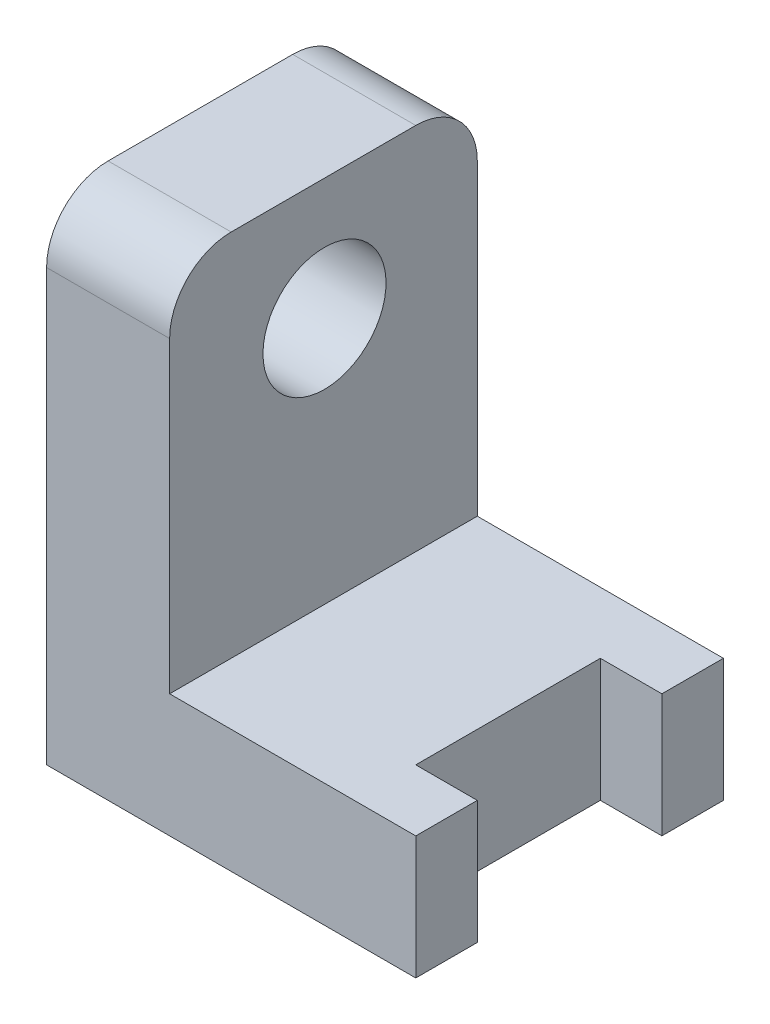
ISO-10303-21;
HEADER;
FILE_DESCRIPTION(('STEP AP214'),'2;1');
FILE_NAME('part.step','',(''),(''),'','','');
FILE_SCHEMA(('AUTOMOTIVE_DESIGN { 1 0 10303 214 1 1 1 1 }'));
ENDSEC;
DATA;
#1=APPLICATION_CONTEXT('core data for automotive mechanical design processes');
#2=APPLICATION_PROTOCOL_DEFINITION('international standard','automotive_design',2000,#1);
#3=PRODUCT_CONTEXT('',#1,'mechanical');
#4=PRODUCT('Part','Part','',(#3));
#5=PRODUCT_RELATED_PRODUCT_CATEGORY('part','',(#4));
#6=PRODUCT_DEFINITION_FORMATION('','',#4);
#7=PRODUCT_DEFINITION_CONTEXT('part definition',#1,'design');
#8=PRODUCT_DEFINITION('design','',#6,#7);
#9=PRODUCT_DEFINITION_SHAPE('','',#8);
#10=(LENGTH_UNIT() NAMED_UNIT(*) SI_UNIT(.MILLI.,.METRE.));
#11=(NAMED_UNIT(*) PLANE_ANGLE_UNIT() SI_UNIT($,.RADIAN.));
#12=(NAMED_UNIT(*) SI_UNIT($,.STERADIAN.) SOLID_ANGLE_UNIT());
#13=UNCERTAINTY_MEASURE_WITH_UNIT(LENGTH_MEASURE(1.E-05),#10,'distance_accuracy_value','');
#14=(GEOMETRIC_REPRESENTATION_CONTEXT(3) GLOBAL_UNCERTAINTY_ASSIGNED_CONTEXT((#13)) GLOBAL_UNIT_ASSIGNED_CONTEXT((#10,
#11,#12)) REPRESENTATION_CONTEXT('',''));
#15=CARTESIAN_POINT('',(0.,0.,0.));
#16=DIRECTION('',(0.,0.,1.));
#17=DIRECTION('',(1.,0.,0.));
#18=AXIS2_PLACEMENT_3D('',#15,#16,#17);
#19=CARTESIAN_POINT('',(30.,0.,12.5));
#20=DIRECTION('',(-1.,0.,0.));
#21=DIRECTION('',(0.,-1.,0.));
#22=AXIS2_PLACEMENT_3D('',#19,#20,#21);
#23=PLANE('',#22);
#24=DIRECTION('',(0.,0.,-1.));
#25=VECTOR('',#24,1.);
#26=CARTESIAN_POINT('',(30.,0.,12.5));
#27=LINE('',#26,#25);
#28=CARTESIAN_POINT('',(30.,0.,12.5));
#29=VERTEX_POINT('',#28);
#30=CARTESIAN_POINT('',(30.,0.,7.5));
#31=VERTEX_POINT('',#30);
#32=EDGE_CURVE('E167',#29,#31,#27,.T.);
#33=ORIENTED_EDGE('',*,*,#32,.T.);
#34=DIRECTION('',(0.,1.,0.));
#35=VECTOR('',#34,1.);
#36=CARTESIAN_POINT('',(30.,-0.000999999999997531,7.5));
#37=LINE('',#36,#35);
#38=CARTESIAN_POINT('',(30.,10.,7.5));
#39=VERTEX_POINT('',#38);
#40=EDGE_CURVE('E149',#31,#39,#37,.T.);
#41=ORIENTED_EDGE('',*,*,#40,.T.);
#42=DIRECTION('',(0.,0.,-1.));
#43=VECTOR('',#42,1.);
#44=CARTESIAN_POINT('',(30.,10.,12.5));
#45=LINE('',#44,#43);
#46=CARTESIAN_POINT('',(30.,10.,12.5));
#47=VERTEX_POINT('',#46);
#48=EDGE_CURVE('E168',#47,#39,#45,.T.);
#49=ORIENTED_EDGE('',*,*,#48,.F.);
#50=DIRECTION('',(0.,1.,0.));
#51=VECTOR('',#50,1.);
#52=CARTESIAN_POINT('',(30.,0.,12.5));
#53=LINE('',#52,#51);
#54=EDGE_CURVE('E274',#29,#47,#53,.T.);
#55=ORIENTED_EDGE('',*,*,#54,.F.);
#56=EDGE_LOOP('',(#33,#41,#49,#55));
#57=FACE_BOUND('',#56,.T.);
#58=ADVANCED_FACE('F43',(#57),#23,.F.);
#59=CARTESIAN_POINT('',(9.99999999999999,40.,12.5));
#60=DIRECTION('',(0.,-1.,0.));
#61=DIRECTION('',(1.,0.,0.));
#62=AXIS2_PLACEMENT_3D('',#59,#60,#61);
#63=PLANE('',#62);
#64=DIRECTION('',(0.,0.,-1.));
#65=VECTOR('',#64,1.);
#66=CARTESIAN_POINT('',(9.99999999999999,40.,12.5));
#67=LINE('',#66,#65);
#68=CARTESIAN_POINT('',(9.99999999999999,40.,7.5));
#69=VERTEX_POINT('',#68);
#70=CARTESIAN_POINT('',(9.99999999999999,40.,-7.5));
#71=VERTEX_POINT('',#70);
#72=EDGE_CURVE('E204',#69,#71,#67,.T.);
#73=ORIENTED_EDGE('',*,*,#72,.T.);
#74=DIRECTION('',(-1.,0.,0.));
#75=VECTOR('',#74,1.);
#76=CARTESIAN_POINT('',(9.99999999999999,40.,-7.5));
#77=LINE('',#76,#75);
#78=CARTESIAN_POINT('',(0.,40.,-7.5));
#79=VERTEX_POINT('',#78);
#80=EDGE_CURVE('E187',#71,#79,#77,.T.);
#81=ORIENTED_EDGE('',*,*,#80,.T.);
#82=DIRECTION('',(0.,0.,-1.));
#83=VECTOR('',#82,1.);
#84=CARTESIAN_POINT('',(0.,40.,12.5));
#85=LINE('',#84,#83);
#86=CARTESIAN_POINT('',(0.,40.,7.5));
#87=VERTEX_POINT('',#86);
#88=EDGE_CURVE('E180',#87,#79,#85,.T.);
#89=ORIENTED_EDGE('',*,*,#88,.F.);
#90=DIRECTION('',(-1.,0.,0.));
#91=VECTOR('',#90,1.);
#92=CARTESIAN_POINT('',(9.99999999999999,40.,7.5));
#93=LINE('',#92,#91);
#94=EDGE_CURVE('E184',#87,#69,#93,.F.);
#95=ORIENTED_EDGE('',*,*,#94,.T.);
#96=EDGE_LOOP('',(#73,#81,#89,#95));
#97=FACE_BOUND('',#96,.T.);
#98=ADVANCED_FACE('F210',(#97),#63,.F.);
#99=CARTESIAN_POINT('',(0.,40.,12.5));
#100=DIRECTION('',(1.,0.,0.));
#101=DIRECTION('',(0.,1.,0.));
#102=AXIS2_PLACEMENT_3D('',#99,#100,#101);
#103=PLANE('',#102);
#104=CARTESIAN_POINT('',(0.,30.1307898100684,-0.0833926003195573));
#105=DIRECTION('',(-1.,0.,0.));
#106=DIRECTION('',(0.,0.,1.));
#107=AXIS2_PLACEMENT_3D('',#104,#105,#106);
#108=CIRCLE('',#107,4.99999999999999);
#109=CARTESIAN_POINT('',(0.,30.1307898100684,4.91660739968043));
#110=VERTEX_POINT('',#109);
#111=EDGE_CURVE('E299',#110,#110,#108,.T.);
#112=ORIENTED_EDGE('',*,*,#111,.F.);
#113=EDGE_LOOP('',(#112));
#114=FACE_BOUND('',#113,.T.);
#115=ORIENTED_EDGE('',*,*,#88,.T.);
#116=CARTESIAN_POINT('',(0.,35.,-7.5));
#117=DIRECTION('',(1.,0.,0.));
#118=DIRECTION('',(0.,1.,0.));
#119=AXIS2_PLACEMENT_3D('',#116,#117,#118);
#120=CIRCLE('',#119,5.);
#121=CARTESIAN_POINT('',(0.,35.,-12.5));
#122=VERTEX_POINT('',#121);
#123=EDGE_CURVE('E194',#79,#122,#120,.F.);
#124=ORIENTED_EDGE('',*,*,#123,.T.);
#125=DIRECTION('',(0.,-1.,0.));
#126=VECTOR('',#125,1.);
#127=CARTESIAN_POINT('',(0.,40.,-12.5));
#128=LINE('',#127,#126);
#129=CARTESIAN_POINT('',(0.,0.,-12.5));
#130=VERTEX_POINT('',#129);
#131=EDGE_CURVE('E148',#122,#130,#128,.T.);
#132=ORIENTED_EDGE('',*,*,#131,.T.);
#133=DIRECTION('',(0.,0.,-1.));
#134=VECTOR('',#133,1.);
#135=CARTESIAN_POINT('',(0.,0.,12.5));
#136=LINE('',#135,#134);
#137=CARTESIAN_POINT('',(0.,0.,12.5));
#138=VERTEX_POINT('',#137);
#139=EDGE_CURVE('E173',#138,#130,#136,.T.);
#140=ORIENTED_EDGE('',*,*,#139,.F.);
#141=DIRECTION('',(0.,-1.,0.));
#142=VECTOR('',#141,1.);
#143=CARTESIAN_POINT('',(0.,40.,12.5));
#144=LINE('',#143,#142);
#145=CARTESIAN_POINT('',(0.,35.,12.5));
#146=VERTEX_POINT('',#145);
#147=EDGE_CURVE('E236',#146,#138,#144,.T.);
#148=ORIENTED_EDGE('',*,*,#147,.F.);
#149=CARTESIAN_POINT('',(0.,35.,7.5));
#150=DIRECTION('',(1.,0.,0.));
#151=DIRECTION('',(0.,1.,0.));
#152=AXIS2_PLACEMENT_3D('',#149,#150,#151);
#153=CIRCLE('',#152,5.);
#154=EDGE_CURVE('E191',#146,#87,#153,.F.);
#155=ORIENTED_EDGE('',*,*,#154,.T.);
#156=EDGE_LOOP('',(#115,#124,#132,#140,#148,#155));
#157=FACE_BOUND('',#156,.T.);
#158=ADVANCED_FACE('F219',(#114,#157),#103,.F.);
#159=CARTESIAN_POINT('',(0.,0.,12.5));
#160=DIRECTION('',(0.,1.,0.));
#161=DIRECTION('',(0.,0.,1.));
#162=AXIS2_PLACEMENT_3D('',#159,#160,#161);
#163=PLANE('',#162);
#164=DIRECTION('',(0.,0.,-1.));
#165=VECTOR('',#164,1.);
#166=CARTESIAN_POINT('',(25.,0.,-7.5));
#167=LINE('',#166,#165);
#168=CARTESIAN_POINT('',(25.,0.,7.5));
#169=VERTEX_POINT('',#168);
#170=CARTESIAN_POINT('',(25.,0.,-7.5));
#171=VERTEX_POINT('',#170);
#172=EDGE_CURVE('E255',#169,#171,#167,.T.);
#173=ORIENTED_EDGE('',*,*,#172,.F.);
#174=DIRECTION('',(-1.,0.,0.));
#175=VECTOR('',#174,1.);
#176=CARTESIAN_POINT('',(25.,0.,7.5));
#177=LINE('',#176,#175);
#178=EDGE_CURVE('E249',#31,#169,#177,.T.);
#179=ORIENTED_EDGE('',*,*,#178,.F.);
#180=ORIENTED_EDGE('',*,*,#32,.F.);
#181=DIRECTION('',(1.,0.,0.));
#182=VECTOR('',#181,1.);
#183=CARTESIAN_POINT('',(0.,0.,12.5));
#184=LINE('',#183,#182);
#185=EDGE_CURVE('E271',#138,#29,#184,.T.);
#186=ORIENTED_EDGE('',*,*,#185,.F.);
#187=ORIENTED_EDGE('',*,*,#139,.T.);
#188=DIRECTION('',(1.,0.,0.));
#189=VECTOR('',#188,1.);
#190=CARTESIAN_POINT('',(0.,0.,-12.5));
#191=LINE('',#190,#189);
#192=CARTESIAN_POINT('',(30.,0.,-12.5));
#193=VERTEX_POINT('',#192);
#194=EDGE_CURVE('E164',#130,#193,#191,.T.);
#195=ORIENTED_EDGE('',*,*,#194,.T.);
#196=CARTESIAN_POINT('',(30.,0.,-7.5));
#197=VERTEX_POINT('',#196);
#198=EDGE_CURVE('E155',#197,#193,#27,.T.);
#199=ORIENTED_EDGE('',*,*,#198,.F.);
#200=DIRECTION('',(1.,0.,0.));
#201=VECTOR('',#200,1.);
#202=CARTESIAN_POINT('',(30.,0.,-7.5));
#203=LINE('',#202,#201);
#204=EDGE_CURVE('E136',#171,#197,#203,.T.);
#205=ORIENTED_EDGE('',*,*,#204,.F.);
#206=EDGE_LOOP('',(#173,#179,#180,#186,#187,#195,#199,#205));
#207=FACE_BOUND('',#206,.T.);
#208=ADVANCED_FACE('F161',(#207),#163,.F.);
#209=CARTESIAN_POINT('',(30.,10.,-7.5));
#210=VERTEX_POINT('',#209);
#211=CARTESIAN_POINT('',(30.,10.,-12.5));
#212=VERTEX_POINT('',#211);
#213=EDGE_CURVE('E157',#210,#212,#45,.T.);
#214=ORIENTED_EDGE('',*,*,#213,.F.);
#215=DIRECTION('',(0.,1.,0.));
#216=VECTOR('',#215,1.);
#217=CARTESIAN_POINT('',(30.,-0.000999999999997531,-7.5));
#218=LINE('',#217,#216);
#219=EDGE_CURVE('E140',#197,#210,#218,.T.);
#220=ORIENTED_EDGE('',*,*,#219,.F.);
#221=ORIENTED_EDGE('',*,*,#198,.T.);
#222=DIRECTION('',(0.,1.,0.));
#223=VECTOR('',#222,1.);
#224=CARTESIAN_POINT('',(30.,0.,-12.5));
#225=LINE('',#224,#223);
#226=EDGE_CURVE('E225',#193,#212,#225,.T.);
#227=ORIENTED_EDGE('',*,*,#226,.T.);
#228=EDGE_LOOP('',(#214,#220,#221,#227));
#229=FACE_BOUND('',#228,.T.);
#230=ADVANCED_FACE('F153',(#229),#23,.F.);
#231=CARTESIAN_POINT('',(30.,10.,12.5));
#232=DIRECTION('',(0.,-1.,0.));
#233=DIRECTION('',(1.,0.,0.));
#234=AXIS2_PLACEMENT_3D('',#231,#232,#233);
#235=PLANE('',#234);
#236=ORIENTED_EDGE('',*,*,#48,.T.);
#237=DIRECTION('',(1.,0.,0.));
#238=VECTOR('',#237,1.);
#239=CARTESIAN_POINT('',(25.,10.,7.5));
#240=LINE('',#239,#238);
#241=CARTESIAN_POINT('',(25.,10.,7.5));
#242=VERTEX_POINT('',#241);
#243=EDGE_CURVE('E159',#242,#39,#240,.T.);
#244=ORIENTED_EDGE('',*,*,#243,.F.);
#245=DIRECTION('',(0.,0.,1.));
#246=VECTOR('',#245,1.);
#247=CARTESIAN_POINT('',(25.,10.,-7.5));
#248=LINE('',#247,#246);
#249=CARTESIAN_POINT('',(25.,10.,-7.5));
#250=VERTEX_POINT('',#249);
#251=EDGE_CURVE('E247',#250,#242,#248,.T.);
#252=ORIENTED_EDGE('',*,*,#251,.F.);
#253=DIRECTION('',(-1.,0.,0.));
#254=VECTOR('',#253,1.);
#255=CARTESIAN_POINT('',(30.,10.,-7.5));
#256=LINE('',#255,#254);
#257=EDGE_CURVE('E244',#210,#250,#256,.T.);
#258=ORIENTED_EDGE('',*,*,#257,.F.);
#259=ORIENTED_EDGE('',*,*,#213,.T.);
#260=DIRECTION('',(-1.,0.,0.));
#261=VECTOR('',#260,1.);
#262=CARTESIAN_POINT('',(30.,10.,-12.5));
#263=LINE('',#262,#261);
#264=CARTESIAN_POINT('',(10.,10.,-12.5));
#265=VERTEX_POINT('',#264);
#266=EDGE_CURVE('E232',#212,#265,#263,.T.);
#267=ORIENTED_EDGE('',*,*,#266,.T.);
#268=DIRECTION('',(0.,0.,-1.));
#269=VECTOR('',#268,1.);
#270=CARTESIAN_POINT('',(10.,10.,12.5));
#271=LINE('',#270,#269);
#272=CARTESIAN_POINT('',(10.,10.,12.5));
#273=VERTEX_POINT('',#272);
#274=EDGE_CURVE('E214',#273,#265,#271,.T.);
#275=ORIENTED_EDGE('',*,*,#274,.F.);
#276=DIRECTION('',(-1.,0.,0.));
#277=VECTOR('',#276,1.);
#278=CARTESIAN_POINT('',(30.,10.,12.5));
#279=LINE('',#278,#277);
#280=EDGE_CURVE('E276',#47,#273,#279,.T.);
#281=ORIENTED_EDGE('',*,*,#280,.F.);
#282=EDGE_LOOP('',(#236,#244,#252,#258,#259,#267,#275,#281));
#283=FACE_BOUND('',#282,.T.);
#284=ADVANCED_FACE('F241',(#283),#235,.F.);
#285=CARTESIAN_POINT('',(10.,10.,12.5));
#286=DIRECTION('',(-1.,0.,0.));
#287=DIRECTION('',(0.,-1.,0.));
#288=AXIS2_PLACEMENT_3D('',#285,#286,#287);
#289=PLANE('',#288);
#290=CARTESIAN_POINT('',(9.99999999999999,30.1307898100684,-0.0833926003195573));
#291=DIRECTION('',(-1.,0.,0.));
#292=DIRECTION('',(0.,-1.,0.));
#293=AXIS2_PLACEMENT_3D('',#290,#291,#292);
#294=CIRCLE('',#293,4.99999999999999);
#295=CARTESIAN_POINT('',(10.,25.1307898100684,-0.0833926003195573));
#296=VERTEX_POINT('',#295);
#297=EDGE_CURVE('E296',#296,#296,#294,.T.);
#298=ORIENTED_EDGE('',*,*,#297,.T.);
#299=EDGE_LOOP('',(#298));
#300=FACE_BOUND('',#299,.T.);
#301=DIRECTION('',(0.,1.,0.));
#302=VECTOR('',#301,1.);
#303=CARTESIAN_POINT('',(10.,10.,-12.5));
#304=LINE('',#303,#302);
#305=CARTESIAN_POINT('',(9.99999999999999,35.,-12.5));
#306=VERTEX_POINT('',#305);
#307=EDGE_CURVE('E206',#265,#306,#304,.T.);
#308=ORIENTED_EDGE('',*,*,#307,.T.);
#309=CARTESIAN_POINT('',(9.99999999999999,35.,-7.5));
#310=DIRECTION('',(-1.,0.,0.));
#311=DIRECTION('',(0.,-1.,0.));
#312=AXIS2_PLACEMENT_3D('',#309,#310,#311);
#313=CIRCLE('',#312,5.);
#314=EDGE_CURVE('E52',#306,#71,#313,.F.);
#315=ORIENTED_EDGE('',*,*,#314,.T.);
#316=ORIENTED_EDGE('',*,*,#72,.F.);
#317=CARTESIAN_POINT('',(9.99999999999999,35.,7.5));
#318=DIRECTION('',(-1.,0.,0.));
#319=DIRECTION('',(0.,-1.,0.));
#320=AXIS2_PLACEMENT_3D('',#317,#318,#319);
#321=CIRCLE('',#320,5.);
#322=CARTESIAN_POINT('',(9.99999999999999,35.,12.5));
#323=VERTEX_POINT('',#322);
#324=EDGE_CURVE('E59',#69,#323,#321,.F.);
#325=ORIENTED_EDGE('',*,*,#324,.T.);
#326=DIRECTION('',(0.,1.,0.));
#327=VECTOR('',#326,1.);
#328=CARTESIAN_POINT('',(10.,10.,12.5));
#329=LINE('',#328,#327);
#330=EDGE_CURVE('E215',#273,#323,#329,.T.);
#331=ORIENTED_EDGE('',*,*,#330,.F.);
#332=ORIENTED_EDGE('',*,*,#274,.T.);
#333=EDGE_LOOP('',(#308,#315,#316,#325,#331,#332));
#334=FACE_BOUND('',#333,.T.);
#335=ADVANCED_FACE('F203',(#300,#334),#289,.F.);
#336=CARTESIAN_POINT('',(0.,0.,12.5));
#337=DIRECTION('',(0.,0.,1.));
#338=DIRECTION('',(1.,0.,0.));
#339=AXIS2_PLACEMENT_3D('',#336,#337,#338);
#340=PLANE('',#339);
#341=ORIENTED_EDGE('',*,*,#330,.T.);
#342=DIRECTION('',(-1.,0.,0.));
#343=VECTOR('',#342,1.);
#344=CARTESIAN_POINT('',(0.,35.,12.5));
#345=LINE('',#344,#343);
#346=EDGE_CURVE('E11',#323,#146,#345,.T.);
#347=ORIENTED_EDGE('',*,*,#346,.T.);
#348=ORIENTED_EDGE('',*,*,#147,.T.);
#349=ORIENTED_EDGE('',*,*,#185,.T.);
#350=ORIENTED_EDGE('',*,*,#54,.T.);
#351=ORIENTED_EDGE('',*,*,#280,.T.);
#352=EDGE_LOOP('',(#341,#347,#348,#349,#350,#351));
#353=FACE_BOUND('',#352,.T.);
#354=ADVANCED_FACE('F282',(#353),#340,.T.);
#355=CARTESIAN_POINT('',(0.,0.,-12.5));
#356=DIRECTION('',(0.,0.,1.));
#357=DIRECTION('',(1.,0.,0.));
#358=AXIS2_PLACEMENT_3D('',#355,#356,#357);
#359=PLANE('',#358);
#360=ORIENTED_EDGE('',*,*,#131,.F.);
#361=DIRECTION('',(-1.,0.,0.));
#362=VECTOR('',#361,1.);
#363=CARTESIAN_POINT('',(0.,35.,-12.5));
#364=LINE('',#363,#362);
#365=EDGE_CURVE('E67',#122,#306,#364,.F.);
#366=ORIENTED_EDGE('',*,*,#365,.T.);
#367=ORIENTED_EDGE('',*,*,#307,.F.);
#368=ORIENTED_EDGE('',*,*,#266,.F.);
#369=ORIENTED_EDGE('',*,*,#226,.F.);
#370=ORIENTED_EDGE('',*,*,#194,.F.);
#371=EDGE_LOOP('',(#360,#366,#367,#368,#369,#370));
#372=FACE_BOUND('',#371,.T.);
#373=ADVANCED_FACE('F221',(#372),#359,.F.);
#374=CARTESIAN_POINT('',(25.,-0.000999999999999265,7.5));
#375=DIRECTION('',(0.,0.,1.));
#376=DIRECTION('',(1.,0.,0.));
#377=AXIS2_PLACEMENT_3D('',#374,#375,#376);
#378=PLANE('',#377);
#379=ORIENTED_EDGE('',*,*,#178,.T.);
#380=DIRECTION('',(0.,1.,0.));
#381=VECTOR('',#380,1.);
#382=CARTESIAN_POINT('',(25.,-0.000999999999999265,7.5));
#383=LINE('',#382,#381);
#384=EDGE_CURVE('E264',#169,#242,#383,.T.);
#385=ORIENTED_EDGE('',*,*,#384,.T.);
#386=ORIENTED_EDGE('',*,*,#243,.T.);
#387=ORIENTED_EDGE('',*,*,#40,.F.);
#388=EDGE_LOOP('',(#379,#385,#386,#387));
#389=FACE_BOUND('',#388,.T.);
#390=ADVANCED_FACE('F292',(#389),#378,.F.);
#391=CARTESIAN_POINT('',(25.,-0.000999999999999265,-7.5));
#392=DIRECTION('',(-1.,0.,0.));
#393=DIRECTION('',(0.,0.,1.));
#394=AXIS2_PLACEMENT_3D('',#391,#392,#393);
#395=PLANE('',#394);
#396=ORIENTED_EDGE('',*,*,#172,.T.);
#397=DIRECTION('',(0.,1.,0.));
#398=VECTOR('',#397,1.);
#399=CARTESIAN_POINT('',(25.,-0.000999999999999265,-7.5));
#400=LINE('',#399,#398);
#401=EDGE_CURVE('E142',#171,#250,#400,.T.);
#402=ORIENTED_EDGE('',*,*,#401,.T.);
#403=ORIENTED_EDGE('',*,*,#251,.T.);
#404=ORIENTED_EDGE('',*,*,#384,.F.);
#405=EDGE_LOOP('',(#396,#402,#403,#404));
#406=FACE_BOUND('',#405,.T.);
#407=ADVANCED_FACE('F294',(#406),#395,.F.);
#408=CARTESIAN_POINT('',(30.,-0.000999999999997531,-7.5));
#409=DIRECTION('',(0.,0.,-1.));
#410=DIRECTION('',(-1.,0.,0.));
#411=AXIS2_PLACEMENT_3D('',#408,#409,#410);
#412=PLANE('',#411);
#413=ORIENTED_EDGE('',*,*,#204,.T.);
#414=ORIENTED_EDGE('',*,*,#219,.T.);
#415=ORIENTED_EDGE('',*,*,#257,.T.);
#416=ORIENTED_EDGE('',*,*,#401,.F.);
#417=EDGE_LOOP('',(#413,#414,#415,#416));
#418=FACE_BOUND('',#417,.T.);
#419=ADVANCED_FACE('F138',(#418),#412,.F.);
#420=CARTESIAN_POINT('',(0.,30.1307898100684,-0.0833926003195573));
#421=DIRECTION('',(-1.,0.,0.));
#422=DIRECTION('',(0.,0.,1.));
#423=AXIS2_PLACEMENT_3D('',#420,#421,#422);
#424=CYLINDRICAL_SURFACE('',#423,4.99999999999999);
#425=ORIENTED_EDGE('',*,*,#297,.F.);
#426=EDGE_LOOP('',(#425));
#427=FACE_BOUND('',#426,.T.);
#428=ORIENTED_EDGE('',*,*,#111,.T.);
#429=EDGE_LOOP('',(#428));
#430=FACE_BOUND('',#429,.T.);
#431=ADVANCED_FACE('F306',(#427,#430),#424,.F.);
#432=CARTESIAN_POINT('',(9.99999999999999,35.,-7.5));
#433=DIRECTION('',(-1.,0.,0.));
#434=DIRECTION('',(0.,-1.,0.));
#435=AXIS2_PLACEMENT_3D('',#432,#433,#434);
#436=CYLINDRICAL_SURFACE('',#435,5.);
#437=ORIENTED_EDGE('',*,*,#314,.F.);
#438=ORIENTED_EDGE('',*,*,#365,.F.);
#439=ORIENTED_EDGE('',*,*,#123,.F.);
#440=ORIENTED_EDGE('',*,*,#80,.F.);
#441=EDGE_LOOP('',(#437,#438,#439,#440));
#442=FACE_BOUND('',#441,.T.);
#443=ADVANCED_FACE('F217',(#442),#436,.T.);
#444=CARTESIAN_POINT('',(0.,35.,7.5));
#445=DIRECTION('',(1.,0.,0.));
#446=DIRECTION('',(0.,1.,0.));
#447=AXIS2_PLACEMENT_3D('',#444,#445,#446);
#448=CYLINDRICAL_SURFACE('',#447,5.);
#449=ORIENTED_EDGE('',*,*,#324,.F.);
#450=ORIENTED_EDGE('',*,*,#94,.F.);
#451=ORIENTED_EDGE('',*,*,#154,.F.);
#452=ORIENTED_EDGE('',*,*,#346,.F.);
#453=EDGE_LOOP('',(#449,#450,#451,#452));
#454=FACE_BOUND('',#453,.T.);
#455=ADVANCED_FACE('F45',(#454),#448,.T.);
#456=CLOSED_SHELL('',(#58,#98,#158,#208,#230,#284,#335,#354,#373,#390,#407,#419,#431,#443,#455));
#457=MANIFOLD_SOLID_BREP('B2',#456);
#458=ADVANCED_BREP_SHAPE_REPRESENTATION('',(#18,#457),#14);
#459=SHAPE_DEFINITION_REPRESENTATION(#9,#458);
ENDSEC;
END-ISO-10303-21;
